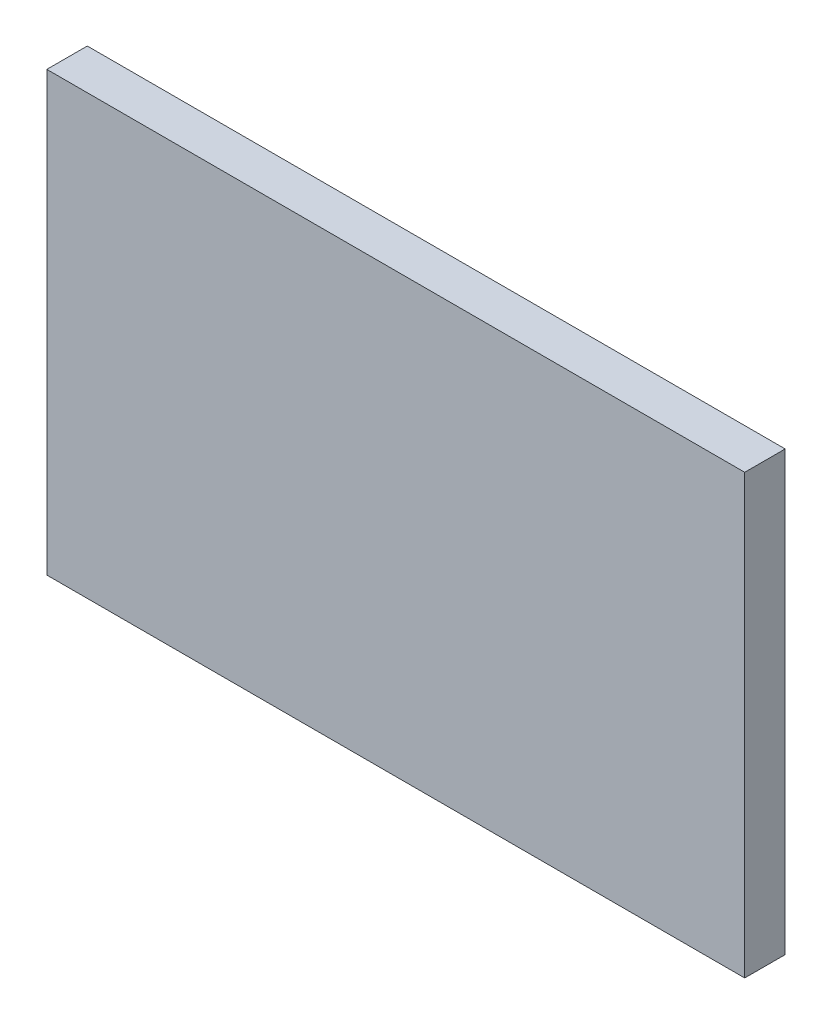
ISO-10303-21;
HEADER;
FILE_DESCRIPTION(('STEP AP214'),'2;1');
FILE_NAME('part.step','',(''),(''),'','','');
FILE_SCHEMA(('AUTOMOTIVE_DESIGN { 1 0 10303 214 1 1 1 1 }'));
ENDSEC;
DATA;
#1=APPLICATION_CONTEXT('core data for automotive mechanical design processes');
#2=APPLICATION_PROTOCOL_DEFINITION('international standard','automotive_design',2000,#1);
#3=PRODUCT_CONTEXT('',#1,'mechanical');
#4=PRODUCT('Part','Part','',(#3));
#5=PRODUCT_RELATED_PRODUCT_CATEGORY('part','',(#4));
#6=PRODUCT_DEFINITION_FORMATION('','',#4);
#7=PRODUCT_DEFINITION_CONTEXT('part definition',#1,'design');
#8=PRODUCT_DEFINITION('design','',#6,#7);
#9=PRODUCT_DEFINITION_SHAPE('','',#8);
#10=(LENGTH_UNIT() NAMED_UNIT(*) SI_UNIT(.MILLI.,.METRE.));
#11=(NAMED_UNIT(*) PLANE_ANGLE_UNIT() SI_UNIT($,.RADIAN.));
#12=(NAMED_UNIT(*) SI_UNIT($,.STERADIAN.) SOLID_ANGLE_UNIT());
#13=UNCERTAINTY_MEASURE_WITH_UNIT(LENGTH_MEASURE(1.E-05),#10,'distance_accuracy_value','');
#14=(GEOMETRIC_REPRESENTATION_CONTEXT(3) GLOBAL_UNCERTAINTY_ASSIGNED_CONTEXT((#13)) GLOBAL_UNIT_ASSIGNED_CONTEXT((#10,
#11,#12)) REPRESENTATION_CONTEXT('',''));
#15=CARTESIAN_POINT('',(0.,0.,0.));
#16=DIRECTION('',(0.,0.,1.));
#17=DIRECTION('',(1.,0.,0.));
#18=AXIS2_PLACEMENT_3D('',#15,#16,#17);
#19=CARTESIAN_POINT('',(-58.9151142974672,41.9401992650889,1.));
#20=DIRECTION('',(1.,0.,0.));
#21=DIRECTION('',(0.,0.,-1.));
#22=AXIS2_PLACEMENT_3D('',#19,#20,#21);
#23=PLANE('',#22);
#24=DIRECTION('',(0.,-1.,0.));
#25=VECTOR('',#24,1.);
#26=CARTESIAN_POINT('',(-58.9151142974672,41.9401992650889,0.));
#27=LINE('',#26,#25);
#28=CARTESIAN_POINT('',(-58.9151142974672,41.9401992650889,0.));
#29=VERTEX_POINT('',#28);
#30=CARTESIAN_POINT('',(-58.9151142974672,31.1148817177833,0.));
#31=VERTEX_POINT('',#30);
#32=EDGE_CURVE('E102',#29,#31,#27,.T.);
#33=ORIENTED_EDGE('',*,*,#32,.T.);
#34=DIRECTION('',(0.,0.,-1.));
#35=VECTOR('',#34,1.);
#36=CARTESIAN_POINT('',(-58.9151142974672,31.1148817177833,1.));
#37=LINE('',#36,#35);
#38=CARTESIAN_POINT('',(-58.9151142974672,31.1148817177833,1.));
#39=VERTEX_POINT('',#38);
#40=EDGE_CURVE('E11',#39,#31,#37,.T.);
#41=ORIENTED_EDGE('',*,*,#40,.F.);
#42=DIRECTION('',(0.,-1.,0.));
#43=VECTOR('',#42,1.);
#44=CARTESIAN_POINT('',(-58.9151142974672,41.9401992650889,1.));
#45=LINE('',#44,#43);
#46=CARTESIAN_POINT('',(-58.9151142974672,41.9401992650889,1.));
#47=VERTEX_POINT('',#46);
#48=EDGE_CURVE('E90',#47,#39,#45,.T.);
#49=ORIENTED_EDGE('',*,*,#48,.F.);
#50=DIRECTION('',(0.,0.,-1.));
#51=VECTOR('',#50,1.);
#52=CARTESIAN_POINT('',(-58.9151142974672,41.9401992650889,1.));
#53=LINE('',#52,#51);
#54=EDGE_CURVE('E98',#47,#29,#53,.T.);
#55=ORIENTED_EDGE('',*,*,#54,.T.);
#56=EDGE_LOOP('',(#33,#41,#49,#55));
#57=FACE_BOUND('',#56,.T.);
#58=ADVANCED_FACE('F39',(#57),#23,.F.);
#59=CARTESIAN_POINT('',(-58.9151142974672,31.1148817177833,1.));
#60=DIRECTION('',(0.,1.,0.));
#61=DIRECTION('',(0.,0.,1.));
#62=AXIS2_PLACEMENT_3D('',#59,#60,#61);
#63=PLANE('',#62);
#64=DIRECTION('',(1.,0.,0.));
#65=VECTOR('',#64,1.);
#66=CARTESIAN_POINT('',(-58.9151142974672,31.1148817177833,0.));
#67=LINE('',#66,#65);
#68=CARTESIAN_POINT('',(-41.6651142974672,31.1148817177833,0.));
#69=VERTEX_POINT('',#68);
#70=EDGE_CURVE('E94',#31,#69,#67,.T.);
#71=ORIENTED_EDGE('',*,*,#70,.T.);
#72=DIRECTION('',(0.,0.,-1.));
#73=VECTOR('',#72,1.);
#74=CARTESIAN_POINT('',(-41.6651142974672,31.1148817177833,1.));
#75=LINE('',#74,#73);
#76=CARTESIAN_POINT('',(-41.6651142974672,31.1148817177833,1.));
#77=VERTEX_POINT('',#76);
#78=EDGE_CURVE('E47',#77,#69,#75,.T.);
#79=ORIENTED_EDGE('',*,*,#78,.F.);
#80=DIRECTION('',(1.,0.,0.));
#81=VECTOR('',#80,1.);
#82=CARTESIAN_POINT('',(-58.9151142974672,31.1148817177833,1.));
#83=LINE('',#82,#81);
#84=EDGE_CURVE('E85',#39,#77,#83,.T.);
#85=ORIENTED_EDGE('',*,*,#84,.F.);
#86=ORIENTED_EDGE('',*,*,#40,.T.);
#87=EDGE_LOOP('',(#71,#79,#85,#86));
#88=FACE_BOUND('',#87,.T.);
#89=ADVANCED_FACE('F93',(#88),#63,.F.);
#90=CARTESIAN_POINT('',(-41.6651142974672,41.9401992650889,1.));
#91=DIRECTION('',(-1.,0.,0.));
#92=DIRECTION('',(0.,0.,1.));
#93=AXIS2_PLACEMENT_3D('',#90,#91,#92);
#94=PLANE('',#93);
#95=DIRECTION('',(0.,1.,0.));
#96=VECTOR('',#95,1.);
#97=CARTESIAN_POINT('',(-41.6651142974672,41.9401992650889,0.));
#98=LINE('',#97,#96);
#99=CARTESIAN_POINT('',(-41.6651142974672,41.9401992650889,0.));
#100=VERTEX_POINT('',#99);
#101=EDGE_CURVE('E72',#69,#100,#98,.T.);
#102=ORIENTED_EDGE('',*,*,#101,.T.);
#103=DIRECTION('',(0.,0.,-1.));
#104=VECTOR('',#103,1.);
#105=CARTESIAN_POINT('',(-41.6651142974672,41.9401992650889,1.));
#106=LINE('',#105,#104);
#107=CARTESIAN_POINT('',(-41.6651142974672,41.9401992650889,1.));
#108=VERTEX_POINT('',#107);
#109=EDGE_CURVE('E95',#108,#100,#106,.T.);
#110=ORIENTED_EDGE('',*,*,#109,.F.);
#111=DIRECTION('',(0.,1.,0.));
#112=VECTOR('',#111,1.);
#113=CARTESIAN_POINT('',(-41.6651142974672,41.9401992650889,1.));
#114=LINE('',#113,#112);
#115=EDGE_CURVE('E88',#77,#108,#114,.T.);
#116=ORIENTED_EDGE('',*,*,#115,.F.);
#117=ORIENTED_EDGE('',*,*,#78,.T.);
#118=EDGE_LOOP('',(#102,#110,#116,#117));
#119=FACE_BOUND('',#118,.T.);
#120=ADVANCED_FACE('F96',(#119),#94,.F.);
#121=CARTESIAN_POINT('',(-58.9151142974672,41.9401992650889,1.));
#122=DIRECTION('',(0.,-1.,0.));
#123=DIRECTION('',(0.,0.,-1.));
#124=AXIS2_PLACEMENT_3D('',#121,#122,#123);
#125=PLANE('',#124);
#126=DIRECTION('',(-1.,0.,0.));
#127=VECTOR('',#126,1.);
#128=CARTESIAN_POINT('',(-58.9151142974672,41.9401992650889,0.));
#129=LINE('',#128,#127);
#130=EDGE_CURVE('E78',#100,#29,#129,.T.);
#131=ORIENTED_EDGE('',*,*,#130,.T.);
#132=ORIENTED_EDGE('',*,*,#54,.F.);
#133=DIRECTION('',(-1.,0.,0.));
#134=VECTOR('',#133,1.);
#135=CARTESIAN_POINT('',(-58.9151142974672,41.9401992650889,1.));
#136=LINE('',#135,#134);
#137=EDGE_CURVE('E55',#108,#47,#136,.T.);
#138=ORIENTED_EDGE('',*,*,#137,.F.);
#139=ORIENTED_EDGE('',*,*,#109,.T.);
#140=EDGE_LOOP('',(#131,#132,#138,#139));
#141=FACE_BOUND('',#140,.T.);
#142=ADVANCED_FACE('F109',(#141),#125,.F.);
#143=CARTESIAN_POINT('',(0.,0.,1.));
#144=DIRECTION('',(0.,0.,1.));
#145=DIRECTION('',(1.,0.,0.));
#146=AXIS2_PLACEMENT_3D('',#143,#144,#145);
#147=PLANE('',#146);
#148=ORIENTED_EDGE('',*,*,#48,.T.);
#149=ORIENTED_EDGE('',*,*,#84,.T.);
#150=ORIENTED_EDGE('',*,*,#115,.T.);
#151=ORIENTED_EDGE('',*,*,#137,.T.);
#152=EDGE_LOOP('',(#148,#149,#150,#151));
#153=FACE_BOUND('',#152,.T.);
#154=ADVANCED_FACE('F86',(#153),#147,.T.);
#155=CARTESIAN_POINT('',(0.,0.,0.));
#156=DIRECTION('',(0.,0.,1.));
#157=DIRECTION('',(1.,0.,0.));
#158=AXIS2_PLACEMENT_3D('',#155,#156,#157);
#159=PLANE('',#158);
#160=ORIENTED_EDGE('',*,*,#32,.F.);
#161=ORIENTED_EDGE('',*,*,#130,.F.);
#162=ORIENTED_EDGE('',*,*,#101,.F.);
#163=ORIENTED_EDGE('',*,*,#70,.F.);
#164=EDGE_LOOP('',(#160,#161,#162,#163));
#165=FACE_BOUND('',#164,.T.);
#166=ADVANCED_FACE('F112',(#165),#159,.F.);
#167=CLOSED_SHELL('',(#58,#89,#120,#142,#154,#166));
#168=MANIFOLD_SOLID_BREP('B2',#167);
#169=ADVANCED_BREP_SHAPE_REPRESENTATION('',(#18,#168),#14);
#170=SHAPE_DEFINITION_REPRESENTATION(#9,#169);
ENDSEC;
END-ISO-10303-21;
